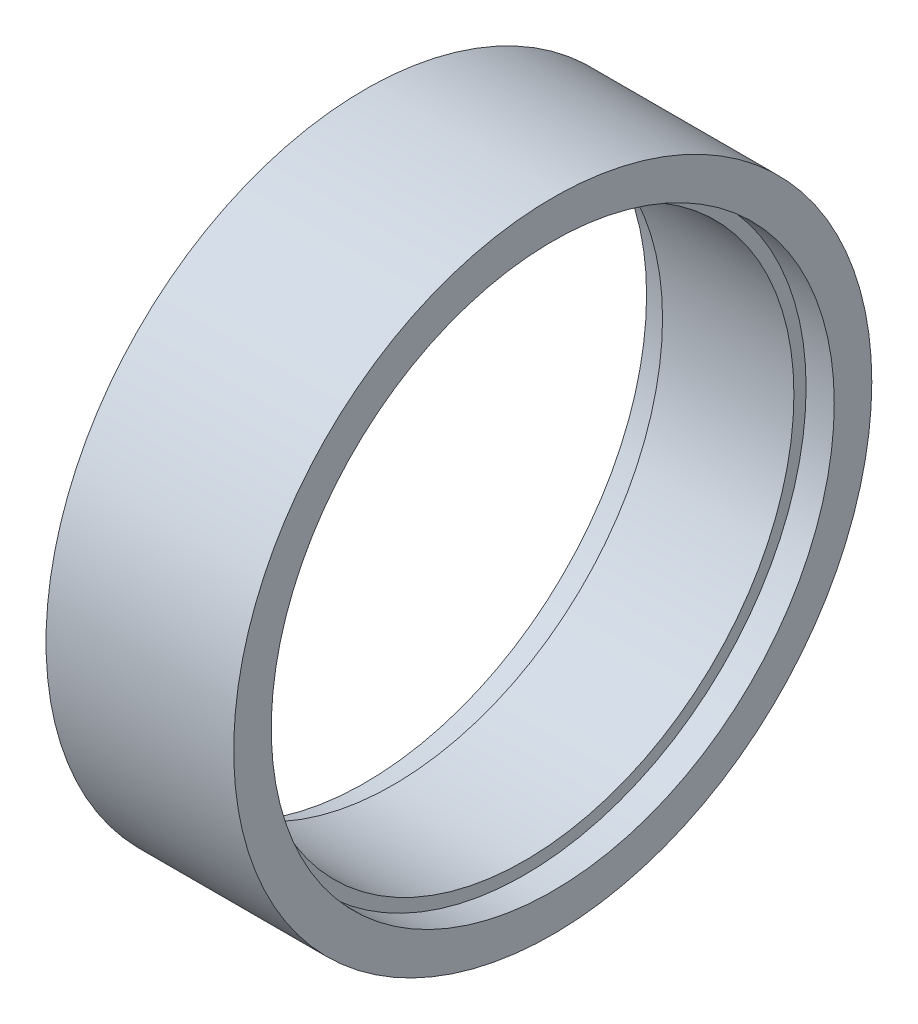
ISO-10303-21;
HEADER;
FILE_DESCRIPTION(('STEP AP214'),'2;1');
FILE_NAME('part.step','',(''),(''),'','','');
FILE_SCHEMA(('AUTOMOTIVE_DESIGN { 1 0 10303 214 1 1 1 1 }'));
ENDSEC;
DATA;
#1=APPLICATION_CONTEXT('core data for automotive mechanical design processes');
#2=APPLICATION_PROTOCOL_DEFINITION('international standard','automotive_design',2000,#1);
#3=PRODUCT_CONTEXT('',#1,'mechanical');
#4=PRODUCT('Part','Part','',(#3));
#5=PRODUCT_RELATED_PRODUCT_CATEGORY('part','',(#4));
#6=PRODUCT_DEFINITION_FORMATION('','',#4);
#7=PRODUCT_DEFINITION_CONTEXT('part definition',#1,'design');
#8=PRODUCT_DEFINITION('design','',#6,#7);
#9=PRODUCT_DEFINITION_SHAPE('','',#8);
#10=(LENGTH_UNIT() NAMED_UNIT(*) SI_UNIT(.MILLI.,.METRE.));
#11=(NAMED_UNIT(*) PLANE_ANGLE_UNIT() SI_UNIT($,.RADIAN.));
#12=(NAMED_UNIT(*) SI_UNIT($,.STERADIAN.) SOLID_ANGLE_UNIT());
#13=UNCERTAINTY_MEASURE_WITH_UNIT(LENGTH_MEASURE(1.E-05),#10,'distance_accuracy_value','');
#14=(GEOMETRIC_REPRESENTATION_CONTEXT(3) GLOBAL_UNCERTAINTY_ASSIGNED_CONTEXT((#13)) GLOBAL_UNIT_ASSIGNED_CONTEXT((#10,
#11,#12)) REPRESENTATION_CONTEXT('',''));
#15=CARTESIAN_POINT('',(0.,0.,0.));
#16=DIRECTION('',(0.,0.,1.));
#17=DIRECTION('',(1.,0.,0.));
#18=AXIS2_PLACEMENT_3D('',#15,#16,#17);
#19=CARTESIAN_POINT('',(-1.5,0.,0.));
#20=DIRECTION('',(1.,0.,0.));
#21=DIRECTION('',(0.,0.,-1.));
#22=AXIS2_PLACEMENT_3D('',#19,#20,#21);
#23=CYLINDRICAL_SURFACE('',#22,17.);
#24=CARTESIAN_POINT('',(-1.5,0.,0.));
#25=DIRECTION('',(1.,0.,0.));
#26=DIRECTION('',(0.,0.,-1.));
#27=AXIS2_PLACEMENT_3D('',#24,#25,#26);
#28=CIRCLE('',#27,17.);
#29=CARTESIAN_POINT('',(-1.5,0.,-17.));
#30=VERTEX_POINT('',#29);
#31=EDGE_CURVE('E11',#30,#30,#28,.T.);
#32=ORIENTED_EDGE('',*,*,#31,.T.);
#33=EDGE_LOOP('',(#32));
#34=FACE_BOUND('',#33,.T.);
#35=CARTESIAN_POINT('',(8.5,0.,0.));
#36=DIRECTION('',(1.,0.,0.));
#37=DIRECTION('',(0.,0.,-1.));
#38=AXIS2_PLACEMENT_3D('',#35,#36,#37);
#39=CIRCLE('',#38,17.);
#40=CARTESIAN_POINT('',(8.5,0.,-17.));
#41=VERTEX_POINT('',#40);
#42=EDGE_CURVE('E52',#41,#41,#39,.T.);
#43=ORIENTED_EDGE('',*,*,#42,.F.);
#44=EDGE_LOOP('',(#43));
#45=FACE_BOUND('',#44,.T.);
#46=ADVANCED_FACE('F42',(#34,#45),#23,.T.);
#47=CARTESIAN_POINT('',(-1.5,0.,0.));
#48=DIRECTION('',(1.,0.,0.));
#49=DIRECTION('',(0.,0.,-1.));
#50=AXIS2_PLACEMENT_3D('',#47,#48,#49);
#51=PLANE('',#50);
#52=CARTESIAN_POINT('',(-1.5,0.,0.));
#53=DIRECTION('',(1.,0.,0.));
#54=DIRECTION('',(0.,0.,-1.));
#55=AXIS2_PLACEMENT_3D('',#52,#53,#54);
#56=CIRCLE('',#55,15.);
#57=CARTESIAN_POINT('',(-1.5,0.,-15.));
#58=VERTEX_POINT('',#57);
#59=EDGE_CURVE('E48',#58,#58,#56,.T.);
#60=ORIENTED_EDGE('',*,*,#59,.T.);
#61=EDGE_LOOP('',(#60));
#62=FACE_BOUND('',#61,.T.);
#63=ORIENTED_EDGE('',*,*,#31,.F.);
#64=EDGE_LOOP('',(#63));
#65=FACE_BOUND('',#64,.T.);
#66=ADVANCED_FACE('F71',(#62,#65),#51,.F.);
#67=CARTESIAN_POINT('',(-1.5,0.,0.));
#68=DIRECTION('',(1.,0.,0.));
#69=DIRECTION('',(0.,0.,-1.));
#70=AXIS2_PLACEMENT_3D('',#67,#68,#69);
#71=CYLINDRICAL_SURFACE('',#70,15.);
#72=ORIENTED_EDGE('',*,*,#59,.F.);
#73=EDGE_LOOP('',(#72));
#74=FACE_BOUND('',#73,.T.);
#75=CARTESIAN_POINT('',(8.5,0.,0.));
#76=DIRECTION('',(1.,0.,0.));
#77=DIRECTION('',(0.,0.,-1.));
#78=AXIS2_PLACEMENT_3D('',#75,#76,#77);
#79=CIRCLE('',#78,15.);
#80=CARTESIAN_POINT('',(8.5,0.,-15.));
#81=VERTEX_POINT('',#80);
#82=EDGE_CURVE('E56',#81,#81,#79,.T.);
#83=ORIENTED_EDGE('',*,*,#82,.T.);
#84=EDGE_LOOP('',(#83));
#85=FACE_BOUND('',#84,.T.);
#86=ADVANCED_FACE('F62',(#74,#85),#71,.F.);
#87=CARTESIAN_POINT('',(8.5,0.,0.));
#88=DIRECTION('',(1.,0.,0.));
#89=DIRECTION('',(0.,0.,-1.));
#90=AXIS2_PLACEMENT_3D('',#87,#88,#89);
#91=PLANE('',#90);
#92=ORIENTED_EDGE('',*,*,#42,.T.);
#93=EDGE_LOOP('',(#92));
#94=FACE_BOUND('',#93,.T.);
#95=ORIENTED_EDGE('',*,*,#82,.F.);
#96=EDGE_LOOP('',(#95));
#97=FACE_BOUND('',#96,.T.);
#98=ADVANCED_FACE('F64',(#94,#97),#91,.T.);
#99=CLOSED_SHELL('',(#46,#66,#86,#98));
#100=MANIFOLD_SOLID_BREP('B2',#99);
#101=CARTESIAN_POINT('',(7.,0.,0.));
#102=DIRECTION('',(1.,0.,0.));
#103=DIRECTION('',(0.,0.,-1.));
#104=AXIS2_PLACEMENT_3D('',#101,#102,#103);
#105=PLANE('',#104);
#106=CARTESIAN_POINT('',(7.,0.,0.));
#107=DIRECTION('',(1.,0.,0.));
#108=DIRECTION('',(0.,0.,-1.));
#109=AXIS2_PLACEMENT_3D('',#106,#107,#108);
#110=CIRCLE('',#109,15.);
#111=CARTESIAN_POINT('',(7.,0.,-15.));
#112=VERTEX_POINT('',#111);
#113=EDGE_CURVE('E41',#112,#112,#110,.T.);
#114=ORIENTED_EDGE('',*,*,#113,.T.);
#115=EDGE_LOOP('',(#114));
#116=FACE_BOUND('',#115,.T.);
#117=CARTESIAN_POINT('',(7.,0.,0.));
#118=DIRECTION('',(1.,0.,0.));
#119=DIRECTION('',(0.,0.,-1.));
#120=AXIS2_PLACEMENT_3D('',#117,#118,#119);
#121=CIRCLE('',#120,14.35);
#122=CARTESIAN_POINT('',(7.,0.,-14.35));
#123=VERTEX_POINT('',#122);
#124=EDGE_CURVE('E114',#123,#123,#121,.T.);
#125=ORIENTED_EDGE('',*,*,#124,.F.);
#126=EDGE_LOOP('',(#125));
#127=FACE_BOUND('',#126,.T.);
#128=ADVANCED_FACE('F103',(#116,#127),#105,.T.);
#129=CARTESIAN_POINT('',(0.,0.,0.));
#130=DIRECTION('',(1.,0.,0.));
#131=DIRECTION('',(0.,0.,-1.));
#132=AXIS2_PLACEMENT_3D('',#129,#130,#131);
#133=PLANE('',#132);
#134=CARTESIAN_POINT('',(0.,0.,0.));
#135=DIRECTION('',(1.,0.,0.));
#136=DIRECTION('',(0.,0.,-1.));
#137=AXIS2_PLACEMENT_3D('',#134,#135,#136);
#138=CIRCLE('',#137,15.);
#139=CARTESIAN_POINT('',(0.,0.,-15.));
#140=VERTEX_POINT('',#139);
#141=EDGE_CURVE('E107',#140,#140,#138,.T.);
#142=ORIENTED_EDGE('',*,*,#141,.F.);
#143=EDGE_LOOP('',(#142));
#144=FACE_BOUND('',#143,.T.);
#145=CARTESIAN_POINT('',(0.,0.,0.));
#146=DIRECTION('',(1.,0.,0.));
#147=DIRECTION('',(0.,0.,-1.));
#148=AXIS2_PLACEMENT_3D('',#145,#146,#147);
#149=CIRCLE('',#148,14.35);
#150=CARTESIAN_POINT('',(0.,0.,-14.35));
#151=VERTEX_POINT('',#150);
#152=EDGE_CURVE('E116',#151,#151,#149,.T.);
#153=ORIENTED_EDGE('',*,*,#152,.T.);
#154=EDGE_LOOP('',(#153));
#155=FACE_BOUND('',#154,.T.);
#156=ADVANCED_FACE('F126',(#144,#155),#133,.F.);
#157=CARTESIAN_POINT('',(7.,0.,0.));
#158=DIRECTION('',(-1.,0.,0.));
#159=DIRECTION('',(0.,0.,1.));
#160=AXIS2_PLACEMENT_3D('',#157,#158,#159);
#161=CYLINDRICAL_SURFACE('',#160,15.);
#162=ORIENTED_EDGE('',*,*,#113,.F.);
#163=EDGE_LOOP('',(#162));
#164=FACE_BOUND('',#163,.T.);
#165=ORIENTED_EDGE('',*,*,#141,.T.);
#166=EDGE_LOOP('',(#165));
#167=FACE_BOUND('',#166,.T.);
#168=ADVANCED_FACE('F105',(#164,#167),#161,.T.);
#169=CARTESIAN_POINT('',(7.,0.,0.));
#170=DIRECTION('',(-1.,0.,0.));
#171=DIRECTION('',(0.,0.,1.));
#172=AXIS2_PLACEMENT_3D('',#169,#170,#171);
#173=CYLINDRICAL_SURFACE('',#172,14.35);
#174=ORIENTED_EDGE('',*,*,#124,.T.);
#175=EDGE_LOOP('',(#174));
#176=FACE_BOUND('',#175,.T.);
#177=ORIENTED_EDGE('',*,*,#152,.F.);
#178=EDGE_LOOP('',(#177));
#179=FACE_BOUND('',#178,.T.);
#180=ADVANCED_FACE('F122',(#176,#179),#173,.F.);
#181=CLOSED_SHELL('',(#128,#156,#168,#180));
#182=MANIFOLD_SOLID_BREP('B6',#181);
#183=ADVANCED_BREP_SHAPE_REPRESENTATION('',(#18,#100,#182),#14);
#184=SHAPE_DEFINITION_REPRESENTATION(#9,#183);
ENDSEC;
END-ISO-10303-21;
